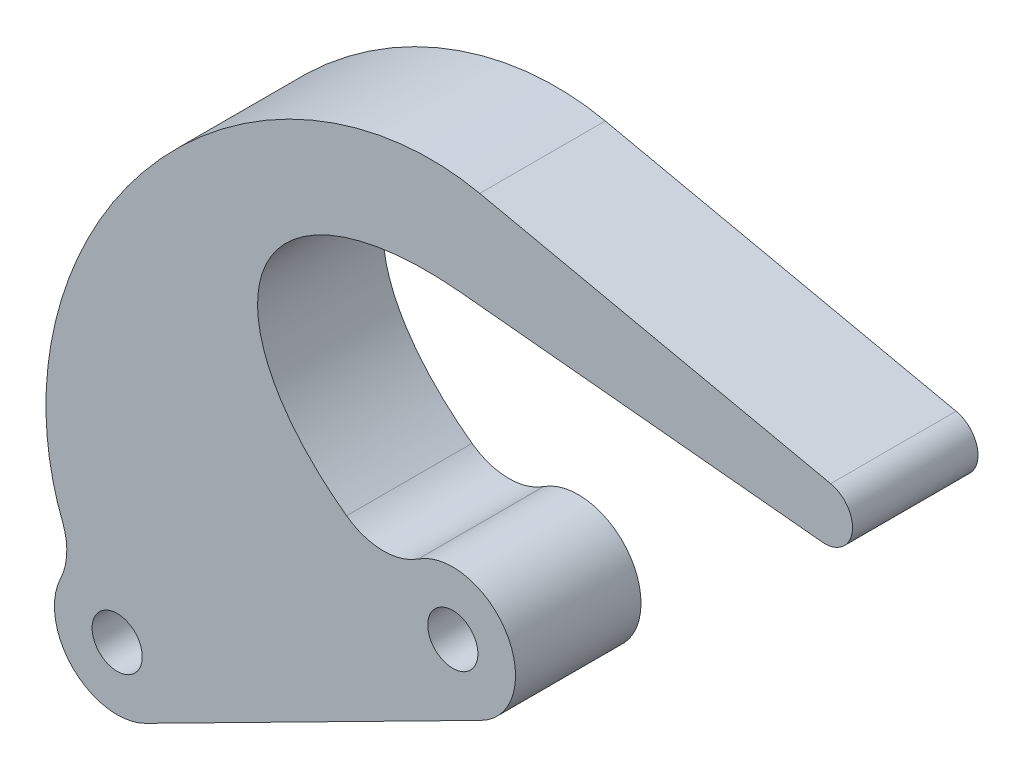
ISO-10303-21;
HEADER;
FILE_DESCRIPTION(('STEP AP214'),'2;1');
FILE_NAME('part.step','',(''),(''),'','','');
FILE_SCHEMA(('AUTOMOTIVE_DESIGN { 1 0 10303 214 1 1 1 1 }'));
ENDSEC;
DATA;
#1=APPLICATION_CONTEXT('core data for automotive mechanical design processes');
#2=APPLICATION_PROTOCOL_DEFINITION('international standard','automotive_design',2000,#1);
#3=PRODUCT_CONTEXT('',#1,'mechanical');
#4=PRODUCT('Part','Part','',(#3));
#5=PRODUCT_RELATED_PRODUCT_CATEGORY('part','',(#4));
#6=PRODUCT_DEFINITION_FORMATION('','',#4);
#7=PRODUCT_DEFINITION_CONTEXT('part definition',#1,'design');
#8=PRODUCT_DEFINITION('design','',#6,#7);
#9=PRODUCT_DEFINITION_SHAPE('','',#8);
#10=(LENGTH_UNIT() NAMED_UNIT(*) SI_UNIT(.MILLI.,.METRE.));
#11=(NAMED_UNIT(*) PLANE_ANGLE_UNIT() SI_UNIT($,.RADIAN.));
#12=(NAMED_UNIT(*) SI_UNIT($,.STERADIAN.) SOLID_ANGLE_UNIT());
#13=UNCERTAINTY_MEASURE_WITH_UNIT(LENGTH_MEASURE(1.E-05),#10,'distance_accuracy_value','');
#14=(GEOMETRIC_REPRESENTATION_CONTEXT(3) GLOBAL_UNCERTAINTY_ASSIGNED_CONTEXT((#13)) GLOBAL_UNIT_ASSIGNED_CONTEXT((#10,
#11,#12)) REPRESENTATION_CONTEXT('',''));
#15=CARTESIAN_POINT('',(0.,0.,0.));
#16=DIRECTION('',(0.,0.,1.));
#17=DIRECTION('',(1.,0.,0.));
#18=AXIS2_PLACEMENT_3D('',#15,#16,#17);
#19=CARTESIAN_POINT('',(14.6428429109654,67.6703648512906,10.));
#20=DIRECTION('',(0.211490264054074,0.977380104263606,0.));
#21=DIRECTION('',(-0.977380104263606,0.211490264054074,0.));
#22=AXIS2_PLACEMENT_3D('',#19,#20,#21);
#23=PLANE('',#22);
#24=DIRECTION('',(0.977380104263606,-0.211490264054074,0.));
#25=VECTOR('',#24,1.);
#26=CARTESIAN_POINT('',(14.6428429109654,67.6703648512906,0.));
#27=LINE('',#26,#25);
#28=CARTESIAN_POINT('',(28.6337228576152,64.6429501521801,0.));
#29=VERTEX_POINT('',#28);
#30=CARTESIAN_POINT('',(56.599353472669,58.5916108856901,0.));
#31=VERTEX_POINT('',#30);
#32=EDGE_CURVE('E151',#29,#31,#27,.T.);
#33=ORIENTED_EDGE('',*,*,#32,.F.);
#34=DIRECTION('',(0.,0.,-1.));
#35=VECTOR('',#34,1.);
#36=CARTESIAN_POINT('',(28.6337228576152,64.6429501521801,10.));
#37=LINE('',#36,#35);
#38=CARTESIAN_POINT('',(28.6337228576152,64.6429501521801,10.));
#39=VERTEX_POINT('',#38);
#40=EDGE_CURVE('E11',#39,#29,#37,.T.);
#41=ORIENTED_EDGE('',*,*,#40,.F.);
#42=DIRECTION('',(0.977380104263606,-0.211490264054074,0.));
#43=VECTOR('',#42,1.);
#44=CARTESIAN_POINT('',(14.6428429109654,67.6703648512906,10.));
#45=LINE('',#44,#43);
#46=CARTESIAN_POINT('',(56.599353472669,58.5916108856901,10.));
#47=VERTEX_POINT('',#46);
#48=EDGE_CURVE('E214',#39,#47,#45,.T.);
#49=ORIENTED_EDGE('',*,*,#48,.T.);
#50=DIRECTION('',(0.,0.,-1.));
#51=VECTOR('',#50,1.);
#52=CARTESIAN_POINT('',(56.599353472669,58.5916108856901,10.));
#53=LINE('',#52,#51);
#54=EDGE_CURVE('E95',#47,#31,#53,.T.);
#55=ORIENTED_EDGE('',*,*,#54,.T.);
#56=EDGE_LOOP('',(#33,#41,#49,#55));
#57=FACE_BOUND('',#56,.T.);
#58=ADVANCED_FACE('F38',(#57),#23,.T.);
#59=CARTESIAN_POINT('',(17.5124244636237,40.3175466021956,10.));
#60=DIRECTION('',(0.,0.,1.));
#61=DIRECTION('',(0.644119276928147,0.764925066323206,0.));
#62=AXIS2_PLACEMENT_3D('',#59,#60,#61);
#63=ELLIPSE('',#62,27.6006772566174,19.9999999999996);
#64=DIRECTION('',(0.,0.,-1.));
#65=VECTOR('',#64,1.);
#66=SURFACE_OF_LINEAR_EXTRUSION('',#63,#65);
#67=CARTESIAN_POINT('',(17.5124244636237,40.3175466021956,0.));
#68=DIRECTION('',(0.,0.,1.));
#69=DIRECTION('',(0.644119276928147,0.764925066323206,0.));
#70=AXIS2_PLACEMENT_3D('',#67,#68,#69);
#71=ELLIPSE('',#70,27.6006772566174,19.9999999999996);
#72=CARTESIAN_POINT('',(-4.62492875051577,25.3684167835267,0.));
#73=VERTEX_POINT('',#72);
#74=EDGE_CURVE('E154',#29,#73,#71,.T.);
#75=ORIENTED_EDGE('',*,*,#74,.T.);
#76=DIRECTION('',(0.,0.,-1.));
#77=VECTOR('',#76,1.);
#78=CARTESIAN_POINT('',(-4.62492875051577,25.3684167835267,10.));
#79=LINE('',#78,#77);
#80=CARTESIAN_POINT('',(-4.62492875051577,25.3684167835267,10.));
#81=VERTEX_POINT('',#80);
#82=EDGE_CURVE('E47',#81,#73,#79,.T.);
#83=ORIENTED_EDGE('',*,*,#82,.F.);
#84=EDGE_CURVE('E212',#39,#81,#63,.T.);
#85=ORIENTED_EDGE('',*,*,#84,.F.);
#86=ORIENTED_EDGE('',*,*,#40,.T.);
#87=EDGE_LOOP('',(#75,#83,#85,#86));
#88=FACE_BOUND('',#87,.T.);
#89=ADVANCED_FACE('F199',(#88),#66,.F.);
#90=CARTESIAN_POINT('',(-9.27802298630356,23.5384675949202,10.));
#91=DIRECTION('',(0.,0.,-1.));
#92=DIRECTION('',(-1.,0.,0.));
#93=AXIS2_PLACEMENT_3D('',#90,#91,#92);
#94=CYLINDRICAL_SURFACE('',#93,5.00000000000031);
#95=CARTESIAN_POINT('',(-9.27802298630356,23.5384675949202,0.));
#96=DIRECTION('',(0.,0.,1.));
#97=DIRECTION('',(1.,0.,0.));
#98=AXIS2_PLACEMENT_3D('',#95,#96,#97);
#99=CIRCLE('',#98,5.00000000000031);
#100=CARTESIAN_POINT('',(-4.77186339996957,21.3717821580158,0.));
#101=VERTEX_POINT('',#100);
#102=EDGE_CURVE('E157',#101,#73,#99,.T.);
#103=ORIENTED_EDGE('',*,*,#102,.F.);
#104=DIRECTION('',(0.,0.,-1.));
#105=VECTOR('',#104,1.);
#106=CARTESIAN_POINT('',(-4.77186339996957,21.3717821580158,10.));
#107=LINE('',#106,#105);
#108=CARTESIAN_POINT('',(-4.77186339996957,21.3717821580158,10.));
#109=VERTEX_POINT('',#108);
#110=EDGE_CURVE('E189',#109,#101,#107,.T.);
#111=ORIENTED_EDGE('',*,*,#110,.F.);
#112=CARTESIAN_POINT('',(-9.27802298630356,23.5384675949202,10.));
#113=DIRECTION('',(0.,0.,1.));
#114=DIRECTION('',(1.,0.,0.));
#115=AXIS2_PLACEMENT_3D('',#112,#113,#114);
#116=CIRCLE('',#115,5.00000000000031);
#117=EDGE_CURVE('E196',#109,#81,#116,.T.);
#118=ORIENTED_EDGE('',*,*,#117,.T.);
#119=ORIENTED_EDGE('',*,*,#82,.T.);
#120=EDGE_LOOP('',(#103,#111,#118,#119));
#121=FACE_BOUND('',#120,.T.);
#122=ADVANCED_FACE('F194',(#121),#94,.F.);
#123=CARTESIAN_POINT('',(-0.265703813635013,19.205096721112,10.));
#124=DIRECTION('',(0.,0.,-1.));
#125=DIRECTION('',(-1.,0.,0.));
#126=AXIS2_PLACEMENT_3D('',#123,#124,#125);
#127=CYLINDRICAL_SURFACE('',#126,5.00000000000058);
#128=CARTESIAN_POINT('',(-0.265703813635013,19.205096721112,0.));
#129=DIRECTION('',(0.,0.,1.));
#130=DIRECTION('',(1.,0.,0.));
#131=AXIS2_PLACEMENT_3D('',#128,#129,#130);
#132=CIRCLE('',#131,5.00000000000058);
#133=CARTESIAN_POINT('',(1.99760929431682,14.7466873886955,0.));
#134=VERTEX_POINT('',#133);
#135=EDGE_CURVE('E160',#101,#134,#132,.T.);
#136=ORIENTED_EDGE('',*,*,#135,.T.);
#137=DIRECTION('',(0.,0.,-1.));
#138=VECTOR('',#137,1.);
#139=CARTESIAN_POINT('',(1.99760929431682,14.7466873886955,10.));
#140=LINE('',#139,#138);
#141=CARTESIAN_POINT('',(1.99760929431682,14.7466873886955,10.));
#142=VERTEX_POINT('',#141);
#143=EDGE_CURVE('E186',#142,#134,#140,.T.);
#144=ORIENTED_EDGE('',*,*,#143,.F.);
#145=CARTESIAN_POINT('',(-0.265703813635013,19.205096721112,10.));
#146=DIRECTION('',(0.,0.,1.));
#147=DIRECTION('',(1.,0.,0.));
#148=AXIS2_PLACEMENT_3D('',#145,#146,#147);
#149=CIRCLE('',#148,5.00000000000058);
#150=EDGE_CURVE('E208',#109,#142,#149,.T.);
#151=ORIENTED_EDGE('',*,*,#150,.F.);
#152=ORIENTED_EDGE('',*,*,#110,.T.);
#153=EDGE_LOOP('',(#136,#144,#151,#152));
#154=FACE_BOUND('',#153,.T.);
#155=ADVANCED_FACE('F205',(#154),#127,.T.);
#156=CARTESIAN_POINT('',(-5.54290389986198,10.9187431420832,10.));
#157=DIRECTION('',(-0.452662621590267,0.891681866483236,0.));
#158=DIRECTION('',(-0.891681866483236,-0.452662621590267,0.));
#159=AXIS2_PLACEMENT_3D('',#156,#157,#158);
#160=PLANE('',#159);
#161=DIRECTION('',(0.891681866483236,0.452662621590267,0.));
#162=VECTOR('',#161,1.);
#163=CARTESIAN_POINT('',(-5.54290389986198,10.9187431420832,0.));
#164=LINE('',#163,#162);
#165=CARTESIAN_POINT('',(28.7480652888136,28.3265660364033,0.));
#166=VERTEX_POINT('',#165);
#167=EDGE_CURVE('E163',#134,#166,#164,.T.);
#168=ORIENTED_EDGE('',*,*,#167,.T.);
#169=DIRECTION('',(0.,0.,-1.));
#170=VECTOR('',#169,1.);
#171=CARTESIAN_POINT('',(28.7480652888136,28.3265660364033,10.));
#172=LINE('',#171,#170);
#173=CARTESIAN_POINT('',(28.7480652888136,28.3265660364033,10.));
#174=VERTEX_POINT('',#173);
#175=EDGE_CURVE('E183',#174,#166,#172,.T.);
#176=ORIENTED_EDGE('',*,*,#175,.F.);
#177=DIRECTION('',(0.891681866483236,0.452662621590267,0.));
#178=VECTOR('',#177,1.);
#179=CARTESIAN_POINT('',(-5.54290389986198,10.9187431420832,10.));
#180=LINE('',#179,#178);
#181=EDGE_CURVE('E210',#142,#174,#180,.T.);
#182=ORIENTED_EDGE('',*,*,#181,.F.);
#183=ORIENTED_EDGE('',*,*,#143,.T.);
#184=EDGE_LOOP('',(#168,#176,#182,#183));
#185=FACE_BOUND('',#184,.T.);
#186=ADVANCED_FACE('F262',(#185),#160,.F.);
#187=CARTESIAN_POINT('',(26.4847521808632,32.7849753688181,10.));
#188=DIRECTION('',(0.,0.,-1.));
#189=DIRECTION('',(-1.,0.,0.));
#190=AXIS2_PLACEMENT_3D('',#187,#188,#189);
#191=CYLINDRICAL_SURFACE('',#190,4.99999999999872);
#192=CARTESIAN_POINT('',(26.4847521808632,32.7849753688181,0.));
#193=DIRECTION('',(0.,0.,1.));
#194=DIRECTION('',(1.,0.,0.));
#195=AXIS2_PLACEMENT_3D('',#192,#193,#194);
#196=CIRCLE('',#195,4.99999999999872);
#197=CARTESIAN_POINT('',(23.7248340887656,36.9542501408738,0.));
#198=VERTEX_POINT('',#197);
#199=EDGE_CURVE('E166',#166,#198,#196,.T.);
#200=ORIENTED_EDGE('',*,*,#199,.T.);
#201=DIRECTION('',(0.,0.,-1.));
#202=VECTOR('',#201,1.);
#203=CARTESIAN_POINT('',(23.7248340887656,36.9542501408738,10.));
#204=LINE('',#203,#202);
#205=CARTESIAN_POINT('',(23.7248340887656,36.9542501408738,10.));
#206=VERTEX_POINT('',#205);
#207=EDGE_CURVE('E181',#206,#198,#204,.T.);
#208=ORIENTED_EDGE('',*,*,#207,.F.);
#209=CARTESIAN_POINT('',(26.4847521808632,32.7849753688181,10.));
#210=DIRECTION('',(0.,0.,1.));
#211=DIRECTION('',(1.,0.,0.));
#212=AXIS2_PLACEMENT_3D('',#209,#210,#211);
#213=CIRCLE('',#212,4.99999999999872);
#214=EDGE_CURVE('E220',#174,#206,#213,.T.);
#215=ORIENTED_EDGE('',*,*,#214,.F.);
#216=ORIENTED_EDGE('',*,*,#175,.T.);
#217=EDGE_LOOP('',(#200,#208,#215,#216));
#218=FACE_BOUND('',#217,.T.);
#219=ADVANCED_FACE('F265',(#218),#191,.T.);
#220=CARTESIAN_POINT('',(20.964915996667,41.1235249129312,10.));
#221=DIRECTION('',(0.,0.,-1.));
#222=DIRECTION('',(-1.,0.,0.));
#223=AXIS2_PLACEMENT_3D('',#220,#221,#222);
#224=CYLINDRICAL_SURFACE('',#223,5.00000000000022);
#225=CARTESIAN_POINT('',(20.964915996667,41.1235249129312,0.));
#226=DIRECTION('',(0.,0.,1.));
#227=DIRECTION('',(1.,0.,0.));
#228=AXIS2_PLACEMENT_3D('',#225,#226,#227);
#229=CIRCLE('',#228,5.00000000000022);
#230=CARTESIAN_POINT('',(18.0183838717117,37.0839768643732,0.));
#231=VERTEX_POINT('',#230);
#232=EDGE_CURVE('E169',#231,#198,#229,.T.);
#233=ORIENTED_EDGE('',*,*,#232,.F.);
#234=DIRECTION('',(0.,0.,-1.));
#235=VECTOR('',#234,1.);
#236=CARTESIAN_POINT('',(18.0183838717117,37.0839768643732,10.));
#237=LINE('',#236,#235);
#238=CARTESIAN_POINT('',(18.0183838717117,37.0839768643732,10.));
#239=VERTEX_POINT('',#238);
#240=EDGE_CURVE('E131',#239,#231,#237,.T.);
#241=ORIENTED_EDGE('',*,*,#240,.F.);
#242=CARTESIAN_POINT('',(20.964915996667,41.1235249129312,10.));
#243=DIRECTION('',(0.,0.,1.));
#244=DIRECTION('',(1.,0.,0.));
#245=AXIS2_PLACEMENT_3D('',#242,#243,#244);
#246=CIRCLE('',#245,5.00000000000022);
#247=EDGE_CURVE('E137',#239,#206,#246,.T.);
#248=ORIENTED_EDGE('',*,*,#247,.T.);
#249=ORIENTED_EDGE('',*,*,#207,.T.);
#250=EDGE_LOOP('',(#233,#241,#248,#249));
#251=FACE_BOUND('',#250,.T.);
#252=ADVANCED_FACE('F223',(#251),#224,.F.);
#253=CARTESIAN_POINT('',(30.2746762696404,44.1707768514241,10.));
#254=DIRECTION('',(0.,0.,1.));
#255=DIRECTION('',(0.948816790217134,-0.315827007398125,0.));
#256=AXIS2_PLACEMENT_3D('',#253,#254,#255);
#257=ELLIPSE('',#256,20.,12.);
#258=DIRECTION('',(0.,0.,-1.));
#259=VECTOR('',#258,1.);
#260=SURFACE_OF_LINEAR_EXTRUSION('',#257,#259);
#261=CARTESIAN_POINT('',(30.2746762696404,44.1707768514241,0.));
#262=DIRECTION('',(0.,0.,1.));
#263=DIRECTION('',(0.948816790217134,-0.315827007398125,0.));
#264=AXIS2_PLACEMENT_3D('',#261,#262,#263);
#265=ELLIPSE('',#264,20.,12.);
#266=CARTESIAN_POINT('',(27.0963411831368,57.0558637004372,0.));
#267=VERTEX_POINT('',#266);
#268=EDGE_CURVE('E126',#267,#231,#265,.T.);
#269=ORIENTED_EDGE('',*,*,#268,.F.);
#270=DIRECTION('',(0.,0.,-1.));
#271=VECTOR('',#270,1.);
#272=CARTESIAN_POINT('',(27.0963411831368,57.0558637004372,10.));
#273=LINE('',#272,#271);
#274=CARTESIAN_POINT('',(27.0963411831368,57.0558637004372,10.));
#275=VERTEX_POINT('',#274);
#276=EDGE_CURVE('E121',#275,#267,#273,.T.);
#277=ORIENTED_EDGE('',*,*,#276,.F.);
#278=EDGE_CURVE('E124',#275,#239,#257,.T.);
#279=ORIENTED_EDGE('',*,*,#278,.T.);
#280=ORIENTED_EDGE('',*,*,#240,.T.);
#281=EDGE_LOOP('',(#269,#277,#279,#280));
#282=FACE_BOUND('',#281,.T.);
#283=ADVANCED_FACE('F123',(#282),#260,.T.);
#284=CARTESIAN_POINT('',(5.80482530591921,59.145515455333,10.));
#285=DIRECTION('',(-0.097675511242539,-0.995218314996016,0.));
#286=DIRECTION('',(0.995218314996016,-0.097675511242539,0.));
#287=AXIS2_PLACEMENT_3D('',#284,#285,#286);
#288=PLANE('',#287);
#289=DIRECTION('',(-0.995218314996016,0.097675511242539,0.));
#290=VECTOR('',#289,1.);
#291=CARTESIAN_POINT('',(5.80482530591921,59.145515455333,0.));
#292=LINE('',#291,#290);
#293=CARTESIAN_POINT('',(55.9153540225203,54.2274271954244,0.));
#294=VERTEX_POINT('',#293);
#295=EDGE_CURVE('E173',#294,#267,#292,.T.);
#296=ORIENTED_EDGE('',*,*,#295,.F.);
#297=DIRECTION('',(0.,0.,-1.));
#298=VECTOR('',#297,1.);
#299=CARTESIAN_POINT('',(55.9153540225203,54.2274271954244,10.));
#300=LINE('',#299,#298);
#301=CARTESIAN_POINT('',(55.9153540225203,54.2274271954244,10.));
#302=VERTEX_POINT('',#301);
#303=EDGE_CURVE('E88',#302,#294,#300,.T.);
#304=ORIENTED_EDGE('',*,*,#303,.F.);
#305=DIRECTION('',(-0.995218314996016,0.097675511242539,0.));
#306=VECTOR('',#305,1.);
#307=CARTESIAN_POINT('',(5.80482530591921,59.145515455333,10.));
#308=LINE('',#307,#306);
#309=EDGE_CURVE('E135',#302,#275,#308,.T.);
#310=ORIENTED_EDGE('',*,*,#309,.T.);
#311=ORIENTED_EDGE('',*,*,#276,.T.);
#312=EDGE_LOOP('',(#296,#304,#310,#311));
#313=FACE_BOUND('',#312,.T.);
#314=ADVANCED_FACE('F139',(#313),#288,.T.);
#315=CARTESIAN_POINT('',(26.4847521808632,32.7849753688181,10.));
#316=DIRECTION('',(0.,0.,-1.));
#317=DIRECTION('',(-1.,0.,0.));
#318=AXIS2_PLACEMENT_3D('',#315,#316,#317);
#319=CYLINDRICAL_SURFACE('',#318,1.9999999999998);
#320=CARTESIAN_POINT('',(26.4847521808632,32.7849753688181,10.));
#321=DIRECTION('',(0.,0.,1.));
#322=DIRECTION('',(1.,0.,0.));
#323=AXIS2_PLACEMENT_3D('',#320,#321,#322);
#324=CIRCLE('',#323,1.9999999999998);
#325=CARTESIAN_POINT('',(28.484752180863,32.7849753688181,10.));
#326=VERTEX_POINT('',#325);
#327=EDGE_CURVE('E226',#326,#326,#324,.T.);
#328=ORIENTED_EDGE('',*,*,#327,.T.);
#329=EDGE_LOOP('',(#328));
#330=FACE_BOUND('',#329,.T.);
#331=CARTESIAN_POINT('',(26.4847521808632,32.7849753688181,0.));
#332=DIRECTION('',(0.,0.,1.));
#333=DIRECTION('',(1.,0.,0.));
#334=AXIS2_PLACEMENT_3D('',#331,#332,#333);
#335=CIRCLE('',#334,1.9999999999998);
#336=CARTESIAN_POINT('',(28.484752180863,32.7849753688181,0.));
#337=VERTEX_POINT('',#336);
#338=EDGE_CURVE('E148',#337,#337,#335,.T.);
#339=ORIENTED_EDGE('',*,*,#338,.F.);
#340=EDGE_LOOP('',(#339));
#341=FACE_BOUND('',#340,.T.);
#342=ADVANCED_FACE('F240',(#330,#341),#319,.F.);
#343=CARTESIAN_POINT('',(-0.265703813635013,19.205096721112,10.));
#344=DIRECTION('',(0.,0.,-1.));
#345=DIRECTION('',(-1.,0.,0.));
#346=AXIS2_PLACEMENT_3D('',#343,#344,#345);
#347=CYLINDRICAL_SURFACE('',#346,2.00000000000021);
#348=CARTESIAN_POINT('',(-0.265703813635013,19.205096721112,10.));
#349=DIRECTION('',(0.,0.,1.));
#350=DIRECTION('',(1.,0.,0.));
#351=AXIS2_PLACEMENT_3D('',#348,#349,#350);
#352=CIRCLE('',#351,2.00000000000021);
#353=CARTESIAN_POINT('',(1.7342961863652,19.205096721112,10.));
#354=VERTEX_POINT('',#353);
#355=EDGE_CURVE('E177',#354,#354,#352,.T.);
#356=ORIENTED_EDGE('',*,*,#355,.T.);
#357=EDGE_LOOP('',(#356));
#358=FACE_BOUND('',#357,.T.);
#359=CARTESIAN_POINT('',(-0.265703813635013,19.205096721112,0.));
#360=DIRECTION('',(0.,0.,1.));
#361=DIRECTION('',(1.,0.,0.));
#362=AXIS2_PLACEMENT_3D('',#359,#360,#361);
#363=CIRCLE('',#362,2.00000000000021);
#364=CARTESIAN_POINT('',(1.7342961863652,19.205096721112,0.));
#365=VERTEX_POINT('',#364);
#366=EDGE_CURVE('E145',#365,#365,#363,.T.);
#367=ORIENTED_EDGE('',*,*,#366,.F.);
#368=EDGE_LOOP('',(#367));
#369=FACE_BOUND('',#368,.T.);
#370=ADVANCED_FACE('F40',(#358,#369),#347,.F.);
#371=CARTESIAN_POINT('',(56.1314516676066,56.4292517006825,10.));
#372=DIRECTION('',(0.,0.,-1.));
#373=DIRECTION('',(-1.,0.,0.));
#374=AXIS2_PLACEMENT_3D('',#371,#372,#373);
#375=CYLINDRICAL_SURFACE('',#374,2.21240352200206);
#376=CARTESIAN_POINT('',(56.1314516676066,56.4292517006825,0.));
#377=DIRECTION('',(0.,0.,1.));
#378=DIRECTION('',(1.,0.,0.));
#379=AXIS2_PLACEMENT_3D('',#376,#377,#378);
#380=CIRCLE('',#379,2.21240352200206);
#381=EDGE_CURVE('E175',#294,#31,#380,.T.);
#382=ORIENTED_EDGE('',*,*,#381,.T.);
#383=ORIENTED_EDGE('',*,*,#54,.F.);
#384=CARTESIAN_POINT('',(56.1314516676066,56.4292517006825,10.));
#385=DIRECTION('',(0.,0.,1.));
#386=DIRECTION('',(1.,0.,0.));
#387=AXIS2_PLACEMENT_3D('',#384,#385,#386);
#388=CIRCLE('',#387,2.21240352200206);
#389=EDGE_CURVE('E55',#302,#47,#388,.T.);
#390=ORIENTED_EDGE('',*,*,#389,.F.);
#391=ORIENTED_EDGE('',*,*,#303,.T.);
#392=EDGE_LOOP('',(#382,#383,#390,#391));
#393=FACE_BOUND('',#392,.T.);
#394=ADVANCED_FACE('F225',(#393),#375,.T.);
#395=CARTESIAN_POINT('',(0.,0.,10.));
#396=DIRECTION('',(0.,0.,1.));
#397=DIRECTION('',(1.,0.,0.));
#398=AXIS2_PLACEMENT_3D('',#395,#396,#397);
#399=PLANE('',#398);
#400=ORIENTED_EDGE('',*,*,#355,.F.);
#401=EDGE_LOOP('',(#400));
#402=FACE_BOUND('',#401,.T.);
#403=ORIENTED_EDGE('',*,*,#327,.F.);
#404=EDGE_LOOP('',(#403));
#405=FACE_BOUND('',#404,.T.);
#406=ORIENTED_EDGE('',*,*,#48,.F.);
#407=ORIENTED_EDGE('',*,*,#84,.T.);
#408=ORIENTED_EDGE('',*,*,#117,.F.);
#409=ORIENTED_EDGE('',*,*,#150,.T.);
#410=ORIENTED_EDGE('',*,*,#181,.T.);
#411=ORIENTED_EDGE('',*,*,#214,.T.);
#412=ORIENTED_EDGE('',*,*,#247,.F.);
#413=ORIENTED_EDGE('',*,*,#278,.F.);
#414=ORIENTED_EDGE('',*,*,#309,.F.);
#415=ORIENTED_EDGE('',*,*,#389,.T.);
#416=EDGE_LOOP('',(#406,#407,#408,#409,#410,#411,#412,#413,#414,#415));
#417=FACE_BOUND('',#416,.T.);
#418=ADVANCED_FACE('F134',(#402,#405,#417),#399,.T.);
#419=CARTESIAN_POINT('',(0.,0.,0.));
#420=DIRECTION('',(0.,0.,1.));
#421=DIRECTION('',(1.,0.,0.));
#422=AXIS2_PLACEMENT_3D('',#419,#420,#421);
#423=PLANE('',#422);
#424=ORIENTED_EDGE('',*,*,#366,.T.);
#425=EDGE_LOOP('',(#424));
#426=FACE_BOUND('',#425,.T.);
#427=ORIENTED_EDGE('',*,*,#338,.T.);
#428=EDGE_LOOP('',(#427));
#429=FACE_BOUND('',#428,.T.);
#430=ORIENTED_EDGE('',*,*,#32,.T.);
#431=ORIENTED_EDGE('',*,*,#381,.F.);
#432=ORIENTED_EDGE('',*,*,#295,.T.);
#433=ORIENTED_EDGE('',*,*,#268,.T.);
#434=ORIENTED_EDGE('',*,*,#232,.T.);
#435=ORIENTED_EDGE('',*,*,#199,.F.);
#436=ORIENTED_EDGE('',*,*,#167,.F.);
#437=ORIENTED_EDGE('',*,*,#135,.F.);
#438=ORIENTED_EDGE('',*,*,#102,.T.);
#439=ORIENTED_EDGE('',*,*,#74,.F.);
#440=EDGE_LOOP('',(#430,#431,#432,#433,#434,#435,#436,#437,#438,#439));
#441=FACE_BOUND('',#440,.T.);
#442=ADVANCED_FACE('F202',(#426,#429,#441),#423,.F.);
#443=CLOSED_SHELL('',(#58,#89,#122,#155,#186,#219,#252,#283,#314,#342,#370,#394,#418,#442));
#444=MANIFOLD_SOLID_BREP('B2',#443);
#445=ADVANCED_BREP_SHAPE_REPRESENTATION('',(#18,#444),#14);
#446=SHAPE_DEFINITION_REPRESENTATION(#9,#445);
ENDSEC;
END-ISO-10303-21;
